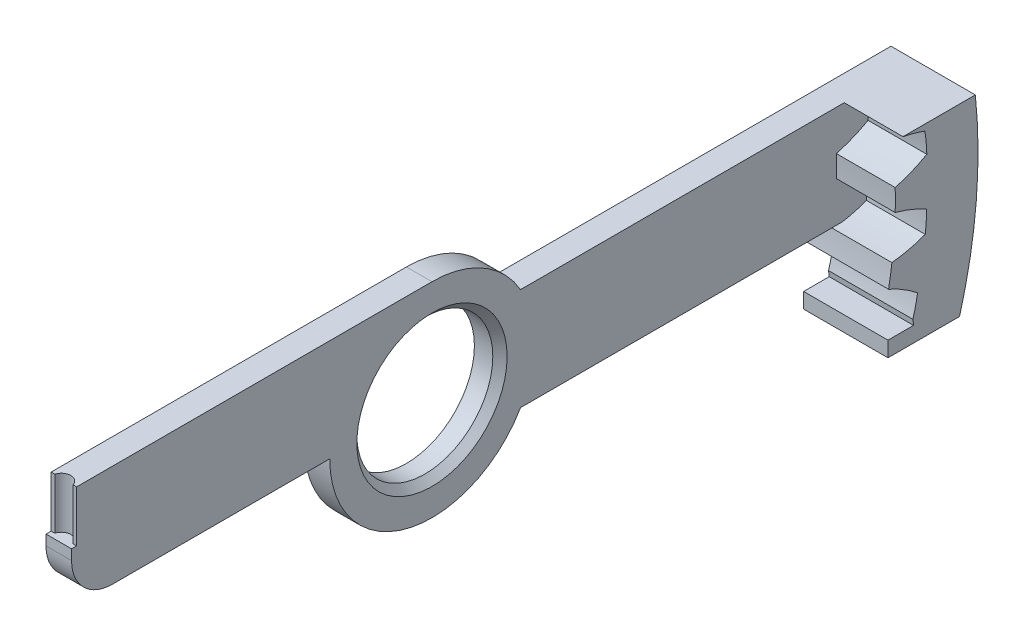
ISO-10303-21;
HEADER;
FILE_DESCRIPTION(('STEP AP214'),'2;1');
FILE_NAME('part.step','',(''),(''),'','','');
FILE_SCHEMA(('AUTOMOTIVE_DESIGN { 1 0 10303 214 1 1 1 1 }'));
ENDSEC;
DATA;
#1=APPLICATION_CONTEXT('core data for automotive mechanical design processes');
#2=APPLICATION_PROTOCOL_DEFINITION('international standard','automotive_design',2000,#1);
#3=PRODUCT_CONTEXT('',#1,'mechanical');
#4=PRODUCT('Part','Part','',(#3));
#5=PRODUCT_RELATED_PRODUCT_CATEGORY('part','',(#4));
#6=PRODUCT_DEFINITION_FORMATION('','',#4);
#7=PRODUCT_DEFINITION_CONTEXT('part definition',#1,'design');
#8=PRODUCT_DEFINITION('design','',#6,#7);
#9=PRODUCT_DEFINITION_SHAPE('','',#8);
#10=(LENGTH_UNIT() NAMED_UNIT(*) SI_UNIT(.MILLI.,.METRE.));
#11=(NAMED_UNIT(*) PLANE_ANGLE_UNIT() SI_UNIT($,.RADIAN.));
#12=(NAMED_UNIT(*) SI_UNIT($,.STERADIAN.) SOLID_ANGLE_UNIT());
#13=UNCERTAINTY_MEASURE_WITH_UNIT(LENGTH_MEASURE(1.E-05),#10,'distance_accuracy_value','');
#14=(GEOMETRIC_REPRESENTATION_CONTEXT(3) GLOBAL_UNCERTAINTY_ASSIGNED_CONTEXT((#13)) GLOBAL_UNIT_ASSIGNED_CONTEXT((#10,
#11,#12)) REPRESENTATION_CONTEXT('',''));
#15=CARTESIAN_POINT('',(0.,0.,0.));
#16=DIRECTION('',(0.,0.,1.));
#17=DIRECTION('',(1.,0.,0.));
#18=AXIS2_PLACEMENT_3D('',#15,#16,#17);
#19=CARTESIAN_POINT('',(1.25,0.,34.75));
#20=DIRECTION('',(0.,0.,-1.));
#21=DIRECTION('',(-1.,0.,0.));
#22=AXIS2_PLACEMENT_3D('',#19,#20,#21);
#23=PLANE('',#22);
#24=DIRECTION('',(-1.,0.,0.));
#25=VECTOR('',#24,1.);
#26=CARTESIAN_POINT('',(1.25,4.99999999999999,34.75));
#27=LINE('',#26,#25);
#28=CARTESIAN_POINT('',(-0.890575656527844,4.99999999999999,34.75));
#29=VERTEX_POINT('',#28);
#30=CARTESIAN_POINT('',(-1.25,4.99999999999999,34.75));
#31=VERTEX_POINT('',#30);
#32=EDGE_CURVE('E395',#29,#31,#27,.T.);
#33=ORIENTED_EDGE('',*,*,#32,.F.);
#34=DIRECTION('',(0.,1.,0.));
#35=VECTOR('',#34,1.);
#36=CARTESIAN_POINT('',(-0.890575656527844,4.99999999999999,34.75));
#37=LINE('',#36,#35);
#38=CARTESIAN_POINT('',(-0.890575656527844,9.99999999999999,34.75));
#39=VERTEX_POINT('',#38);
#40=EDGE_CURVE('E491',#29,#39,#37,.T.);
#41=ORIENTED_EDGE('',*,*,#40,.T.);
#42=DIRECTION('',(-1.,0.,0.));
#43=VECTOR('',#42,1.);
#44=CARTESIAN_POINT('',(1.25,9.99999999999999,34.75));
#45=LINE('',#44,#43);
#46=CARTESIAN_POINT('',(-1.25,9.99999999999999,34.75));
#47=VERTEX_POINT('',#46);
#48=EDGE_CURVE('E398',#39,#47,#45,.T.);
#49=ORIENTED_EDGE('',*,*,#48,.T.);
#50=DIRECTION('',(0.,-1.,0.));
#51=VECTOR('',#50,1.);
#52=CARTESIAN_POINT('',(-1.25,0.,34.75));
#53=LINE('',#52,#51);
#54=EDGE_CURVE('E386',#47,#31,#53,.T.);
#55=ORIENTED_EDGE('',*,*,#54,.T.);
#56=EDGE_LOOP('',(#33,#41,#49,#55));
#57=FACE_BOUND('',#56,.T.);
#58=ADVANCED_FACE('F37',(#57),#23,.F.);
#59=CARTESIAN_POINT('',(1.25,0.,35.25));
#60=DIRECTION('',(0.,0.,-1.));
#61=DIRECTION('',(-1.,0.,0.));
#62=AXIS2_PLACEMENT_3D('',#59,#60,#61);
#63=PLANE('',#62);
#64=DIRECTION('',(0.,-1.,0.));
#65=VECTOR('',#64,1.);
#66=CARTESIAN_POINT('',(-1.25,0.,35.25));
#67=LINE('',#66,#65);
#68=CARTESIAN_POINT('',(-1.25,4.99999999999999,35.25));
#69=VERTEX_POINT('',#68);
#70=CARTESIAN_POINT('',(-1.25,4.00000000000002,35.25));
#71=VERTEX_POINT('',#70);
#72=EDGE_CURVE('E288',#69,#71,#67,.T.);
#73=ORIENTED_EDGE('',*,*,#72,.T.);
#74=DIRECTION('',(-1.,0.,0.));
#75=VECTOR('',#74,1.);
#76=CARTESIAN_POINT('',(1.25,4.00000000000002,35.25));
#77=LINE('',#76,#75);
#78=CARTESIAN_POINT('',(1.25,4.00000000000002,35.25));
#79=VERTEX_POINT('',#78);
#80=EDGE_CURVE('E417',#79,#71,#77,.T.);
#81=ORIENTED_EDGE('',*,*,#80,.F.);
#82=DIRECTION('',(0.,-1.,0.));
#83=VECTOR('',#82,1.);
#84=CARTESIAN_POINT('',(1.25,0.,35.25));
#85=LINE('',#84,#83);
#86=CARTESIAN_POINT('',(1.25,4.99999999999999,35.25));
#87=VERTEX_POINT('',#86);
#88=EDGE_CURVE('E320',#87,#79,#85,.T.);
#89=ORIENTED_EDGE('',*,*,#88,.F.);
#90=DIRECTION('',(-1.,0.,0.));
#91=VECTOR('',#90,1.);
#92=CARTESIAN_POINT('',(1.25,4.99999999999999,35.25));
#93=LINE('',#92,#91);
#94=EDGE_CURVE('E367',#87,#69,#93,.T.);
#95=ORIENTED_EDGE('',*,*,#94,.T.);
#96=EDGE_LOOP('',(#73,#81,#89,#95));
#97=FACE_BOUND('',#96,.T.);
#98=ADVANCED_FACE('F454',(#97),#63,.F.);
#99=CARTESIAN_POINT('',(1.25,4.,31.25));
#100=DIRECTION('',(-1.,0.,0.));
#101=DIRECTION('',(0.,0.,1.));
#102=AXIS2_PLACEMENT_3D('',#99,#100,#101);
#103=CYLINDRICAL_SURFACE('',#102,4.);
#104=CARTESIAN_POINT('',(-1.25,4.,31.25));
#105=DIRECTION('',(1.,0.,0.));
#106=DIRECTION('',(0.,0.,-1.));
#107=AXIS2_PLACEMENT_3D('',#104,#105,#106);
#108=CIRCLE('',#107,4.);
#109=CARTESIAN_POINT('',(-1.25,0.,31.25));
#110=VERTEX_POINT('',#109);
#111=EDGE_CURVE('E370',#71,#110,#108,.T.);
#112=ORIENTED_EDGE('',*,*,#111,.T.);
#113=DIRECTION('',(-1.,0.,0.));
#114=VECTOR('',#113,1.);
#115=CARTESIAN_POINT('',(1.25,0.,31.25));
#116=LINE('',#115,#114);
#117=CARTESIAN_POINT('',(1.25,0.,31.25));
#118=VERTEX_POINT('',#117);
#119=EDGE_CURVE('E415',#118,#110,#116,.T.);
#120=ORIENTED_EDGE('',*,*,#119,.F.);
#121=CARTESIAN_POINT('',(1.25,4.,31.25));
#122=DIRECTION('',(1.,0.,0.));
#123=DIRECTION('',(0.,0.,-1.));
#124=AXIS2_PLACEMENT_3D('',#121,#122,#123);
#125=CIRCLE('',#124,4.);
#126=EDGE_CURVE('E323',#79,#118,#125,.T.);
#127=ORIENTED_EDGE('',*,*,#126,.F.);
#128=ORIENTED_EDGE('',*,*,#80,.T.);
#129=EDGE_LOOP('',(#112,#120,#127,#128));
#130=FACE_BOUND('',#129,.T.);
#131=ADVANCED_FACE('F461',(#130),#103,.T.);
#132=CARTESIAN_POINT('',(1.25,0.,0.));
#133=DIRECTION('',(0.,-1.,0.));
#134=DIRECTION('',(0.,0.,-1.));
#135=AXIS2_PLACEMENT_3D('',#132,#133,#134);
#136=PLANE('',#135);
#137=DIRECTION('',(0.,0.,1.));
#138=VECTOR('',#137,1.);
#139=CARTESIAN_POINT('',(-1.25,0.,0.));
#140=LINE('',#139,#138);
#141=CARTESIAN_POINT('',(-1.25,0.,10.));
#142=VERTEX_POINT('',#141);
#143=EDGE_CURVE('E373',#142,#110,#140,.T.);
#144=ORIENTED_EDGE('',*,*,#143,.F.);
#145=DIRECTION('',(-1.,0.,0.));
#146=VECTOR('',#145,1.);
#147=CARTESIAN_POINT('',(1.25,0.,10.));
#148=LINE('',#147,#146);
#149=CARTESIAN_POINT('',(1.25,0.,10.));
#150=VERTEX_POINT('',#149);
#151=EDGE_CURVE('E413',#150,#142,#148,.T.);
#152=ORIENTED_EDGE('',*,*,#151,.F.);
#153=DIRECTION('',(0.,0.,1.));
#154=VECTOR('',#153,1.);
#155=CARTESIAN_POINT('',(1.25,0.,0.));
#156=LINE('',#155,#154);
#157=EDGE_CURVE('E326',#150,#118,#156,.T.);
#158=ORIENTED_EDGE('',*,*,#157,.T.);
#159=ORIENTED_EDGE('',*,*,#119,.T.);
#160=EDGE_LOOP('',(#144,#152,#158,#159));
#161=FACE_BOUND('',#160,.T.);
#162=ADVANCED_FACE('F673',(#161),#136,.T.);
#163=CARTESIAN_POINT('',(1.25,0.,0.));
#164=DIRECTION('',(-1.,0.,0.));
#165=DIRECTION('',(0.,0.,1.));
#166=AXIS2_PLACEMENT_3D('',#163,#164,#165);
#167=CYLINDRICAL_SURFACE('',#166,10.);
#168=CARTESIAN_POINT('',(-1.25,0.,0.));
#169=DIRECTION('',(1.,0.,0.));
#170=DIRECTION('',(0.,0.,-1.));
#171=AXIS2_PLACEMENT_3D('',#168,#169,#170);
#172=CIRCLE('',#171,10.);
#173=CARTESIAN_POINT('',(-1.25,-5.00000000000216,-8.66025403784314));
#174=VERTEX_POINT('',#173);
#175=EDGE_CURVE('E376',#142,#174,#172,.T.);
#176=ORIENTED_EDGE('',*,*,#175,.T.);
#177=DIRECTION('',(-1.,0.,0.));
#178=VECTOR('',#177,1.);
#179=CARTESIAN_POINT('',(1.25,-5.00000000000216,-8.66025403784314));
#180=LINE('',#179,#178);
#181=CARTESIAN_POINT('',(1.25,-5.00000000000216,-8.66025403784314));
#182=VERTEX_POINT('',#181);
#183=EDGE_CURVE('E410',#182,#174,#180,.T.);
#184=ORIENTED_EDGE('',*,*,#183,.F.);
#185=CARTESIAN_POINT('',(1.25,0.,0.));
#186=DIRECTION('',(1.,0.,0.));
#187=DIRECTION('',(0.,0.,-1.));
#188=AXIS2_PLACEMENT_3D('',#185,#186,#187);
#189=CIRCLE('',#188,10.);
#190=EDGE_CURVE('E329',#150,#182,#189,.T.);
#191=ORIENTED_EDGE('',*,*,#190,.F.);
#192=ORIENTED_EDGE('',*,*,#151,.T.);
#193=EDGE_LOOP('',(#176,#184,#191,#192));
#194=FACE_BOUND('',#193,.T.);
#195=ADVANCED_FACE('F678',(#194),#167,.T.);
#196=CARTESIAN_POINT('',(1.25,-5.00000000000216,0.));
#197=DIRECTION('',(0.,1.,0.));
#198=DIRECTION('',(0.,0.,1.));
#199=AXIS2_PLACEMENT_3D('',#196,#197,#198);
#200=PLANE('',#199);
#201=DIRECTION('',(0.,0.,-1.));
#202=VECTOR('',#201,1.);
#203=CARTESIAN_POINT('',(-1.25,-5.00000000000216,0.));
#204=LINE('',#203,#202);
#205=CARTESIAN_POINT('',(-1.25,-5.00000000000216,-40.1461106926721));
#206=VERTEX_POINT('',#205);
#207=EDGE_CURVE('E378',#174,#206,#204,.T.);
#208=ORIENTED_EDGE('',*,*,#207,.T.);
#209=DIRECTION('',(-1.,0.,0.));
#210=VECTOR('',#209,1.);
#211=CARTESIAN_POINT('',(1.25,-5.00000000000216,-40.1461106926721));
#212=LINE('',#211,#210);
#213=CARTESIAN_POINT('',(1.25,-5.00000000000216,-40.1461106926721));
#214=VERTEX_POINT('',#213);
#215=EDGE_CURVE('E407',#214,#206,#212,.T.);
#216=ORIENTED_EDGE('',*,*,#215,.F.);
#217=DIRECTION('',(0.,0.,-1.));
#218=VECTOR('',#217,1.);
#219=CARTESIAN_POINT('',(1.25,-5.00000000000216,0.));
#220=LINE('',#219,#218);
#221=EDGE_CURVE('E331',#182,#214,#220,.T.);
#222=ORIENTED_EDGE('',*,*,#221,.F.);
#223=ORIENTED_EDGE('',*,*,#183,.T.);
#224=EDGE_LOOP('',(#208,#216,#222,#223));
#225=FACE_BOUND('',#224,.T.);
#226=ADVANCED_FACE('F682',(#225),#200,.F.);
#227=CARTESIAN_POINT('',(1.25,5.00000000001012,-4.59267688199947E-12));
#228=DIRECTION('',(0.,1.,-9.18535376398035E-13));
#229=DIRECTION('',(0.,9.18535376398035E-13,1.));
#230=AXIS2_PLACEMENT_3D('',#227,#228,#229);
#231=PLANE('',#230);
#232=DIRECTION('',(0.,-9.18535376398035E-13,-1.));
#233=VECTOR('',#232,1.);
#234=CARTESIAN_POINT('',(1.25,5.00000000001012,-4.59267688199947E-12));
#235=LINE('',#234,#233);
#236=CARTESIAN_POINT('',(1.25,5.00000000000216,-8.66025403784314));
#237=VERTEX_POINT('',#236);
#238=CARTESIAN_POINT('',(1.25,5.00000000000216,-40.3212792526943));
#239=VERTEX_POINT('',#238);
#240=EDGE_CURVE('E358',#237,#239,#235,.T.);
#241=ORIENTED_EDGE('',*,*,#240,.T.);
#242=DIRECTION('',(1.,0.,0.));
#243=VECTOR('',#242,1.);
#244=CARTESIAN_POINT('',(-1.25,5.00000000000216,-40.3212792526943));
#245=LINE('',#244,#243);
#246=CARTESIAN_POINT('',(7.,5.00000000000216,-40.3212792526943));
#247=VERTEX_POINT('',#246);
#248=EDGE_CURVE('E51',#247,#239,#245,.F.);
#249=ORIENTED_EDGE('',*,*,#248,.F.);
#250=DIRECTION('',(0.,0.,-1.));
#251=VECTOR('',#250,1.);
#252=CARTESIAN_POINT('',(7.,5.00000000000216,0.));
#253=LINE('',#252,#251);
#254=CARTESIAN_POINT('',(7.,5.00000000000216,-47.3937881405345));
#255=VERTEX_POINT('',#254);
#256=EDGE_CURVE('E11',#247,#255,#253,.T.);
#257=ORIENTED_EDGE('',*,*,#256,.T.);
#258=DIRECTION('',(1.,0.,0.));
#259=VECTOR('',#258,1.);
#260=CARTESIAN_POINT('',(-1.25,5.00000000000216,-47.3937881405345));
#261=LINE('',#260,#259);
#262=CARTESIAN_POINT('',(-1.25,5.00000000000216,-47.3937881405345));
#263=VERTEX_POINT('',#262);
#264=EDGE_CURVE('E240',#255,#263,#261,.F.);
#265=ORIENTED_EDGE('',*,*,#264,.T.);
#266=DIRECTION('',(0.,-9.18535376398035E-13,-1.));
#267=VECTOR('',#266,1.);
#268=CARTESIAN_POINT('',(-1.25,5.00000000001012,-4.59267688199947E-12));
#269=LINE('',#268,#267);
#270=CARTESIAN_POINT('',(-1.25,5.00000000000216,-8.66025403784314));
#271=VERTEX_POINT('',#270);
#272=EDGE_CURVE('E381',#271,#263,#269,.T.);
#273=ORIENTED_EDGE('',*,*,#272,.F.);
#274=DIRECTION('',(-1.,0.,0.));
#275=VECTOR('',#274,1.);
#276=CARTESIAN_POINT('',(1.25,5.00000000000216,-8.66025403784314));
#277=LINE('',#276,#275);
#278=EDGE_CURVE('E405',#237,#271,#277,.T.);
#279=ORIENTED_EDGE('',*,*,#278,.F.);
#280=EDGE_LOOP('',(#241,#249,#257,#265,#273,#279));
#281=FACE_BOUND('',#280,.T.);
#282=ADVANCED_FACE('F238',(#281),#231,.T.);
#283=CARTESIAN_POINT('',(-1.25,9.99999999999999,0.));
#284=VERTEX_POINT('',#283);
#285=EDGE_CURVE('E379',#271,#284,#172,.T.);
#286=ORIENTED_EDGE('',*,*,#285,.T.);
#287=DIRECTION('',(-1.,0.,0.));
#288=VECTOR('',#287,1.);
#289=CARTESIAN_POINT('',(1.25,9.99999999999999,0.));
#290=LINE('',#289,#288);
#291=CARTESIAN_POINT('',(1.25,9.99999999999999,0.));
#292=VERTEX_POINT('',#291);
#293=EDGE_CURVE('E402',#292,#284,#290,.T.);
#294=ORIENTED_EDGE('',*,*,#293,.F.);
#295=EDGE_CURVE('E332',#237,#292,#189,.T.);
#296=ORIENTED_EDGE('',*,*,#295,.F.);
#297=ORIENTED_EDGE('',*,*,#278,.T.);
#298=EDGE_LOOP('',(#286,#294,#296,#297));
#299=FACE_BOUND('',#298,.T.);
#300=ADVANCED_FACE('F473',(#299),#167,.T.);
#301=CARTESIAN_POINT('',(1.25,9.99999999999999,0.));
#302=DIRECTION('',(0.,-1.,0.));
#303=DIRECTION('',(0.,0.,-1.));
#304=AXIS2_PLACEMENT_3D('',#301,#302,#303);
#305=PLANE('',#304);
#306=ORIENTED_EDGE('',*,*,#48,.F.);
#307=CARTESIAN_POINT('',(0.,9.99999999999999,35.));
#308=DIRECTION('',(0.,1.,0.));
#309=DIRECTION('',(0.,0.,1.));
#310=AXIS2_PLACEMENT_3D('',#307,#308,#309);
#311=CIRCLE('',#310,0.925000000000001);
#312=CARTESIAN_POINT('',(0.890575656527844,9.99999999999999,34.75));
#313=VERTEX_POINT('',#312);
#314=EDGE_CURVE('E483',#313,#39,#311,.T.);
#315=ORIENTED_EDGE('',*,*,#314,.F.);
#316=CARTESIAN_POINT('',(1.25,9.99999999999999,34.75));
#317=VERTEX_POINT('',#316);
#318=EDGE_CURVE('E399',#317,#313,#45,.T.);
#319=ORIENTED_EDGE('',*,*,#318,.F.);
#320=DIRECTION('',(0.,0.,1.));
#321=VECTOR('',#320,1.);
#322=CARTESIAN_POINT('',(1.25,9.99999999999999,0.));
#323=LINE('',#322,#321);
#324=EDGE_CURVE('E360',#292,#317,#323,.T.);
#325=ORIENTED_EDGE('',*,*,#324,.F.);
#326=ORIENTED_EDGE('',*,*,#293,.T.);
#327=DIRECTION('',(0.,0.,1.));
#328=VECTOR('',#327,1.);
#329=CARTESIAN_POINT('',(-1.25,9.99999999999999,0.));
#330=LINE('',#329,#328);
#331=EDGE_CURVE('E383',#284,#47,#330,.T.);
#332=ORIENTED_EDGE('',*,*,#331,.T.);
#333=EDGE_LOOP('',(#306,#315,#319,#325,#326,#332));
#334=FACE_BOUND('',#333,.T.);
#335=ADVANCED_FACE('F467',(#334),#305,.F.);
#336=ORIENTED_EDGE('',*,*,#318,.T.);
#337=DIRECTION('',(0.,1.,0.));
#338=VECTOR('',#337,1.);
#339=CARTESIAN_POINT('',(0.890575656527844,4.99999999999999,34.75));
#340=LINE('',#339,#338);
#341=CARTESIAN_POINT('',(0.890575656527844,4.99999999999999,34.75));
#342=VERTEX_POINT('',#341);
#343=EDGE_CURVE('E479',#313,#342,#340,.F.);
#344=ORIENTED_EDGE('',*,*,#343,.T.);
#345=CARTESIAN_POINT('',(1.25,4.99999999999999,34.75));
#346=VERTEX_POINT('',#345);
#347=EDGE_CURVE('E396',#346,#342,#27,.T.);
#348=ORIENTED_EDGE('',*,*,#347,.F.);
#349=DIRECTION('',(0.,-1.,0.));
#350=VECTOR('',#349,1.);
#351=CARTESIAN_POINT('',(1.25,0.,34.75));
#352=LINE('',#351,#350);
#353=EDGE_CURVE('E362',#317,#346,#352,.T.);
#354=ORIENTED_EDGE('',*,*,#353,.F.);
#355=EDGE_LOOP('',(#336,#344,#348,#354));
#356=FACE_BOUND('',#355,.T.);
#357=ADVANCED_FACE('F457',(#356),#23,.F.);
#358=CARTESIAN_POINT('',(1.25,4.99999999999999,0.));
#359=DIRECTION('',(0.,1.,0.));
#360=DIRECTION('',(0.,0.,1.));
#361=AXIS2_PLACEMENT_3D('',#358,#359,#360);
#362=PLANE('',#361);
#363=DIRECTION('',(0.,0.,-1.));
#364=VECTOR('',#363,1.);
#365=CARTESIAN_POINT('',(-1.25,4.99999999999999,0.));
#366=LINE('',#365,#364);
#367=EDGE_CURVE('E389',#69,#31,#366,.T.);
#368=ORIENTED_EDGE('',*,*,#367,.F.);
#369=ORIENTED_EDGE('',*,*,#94,.F.);
#370=DIRECTION('',(0.,0.,-1.));
#371=VECTOR('',#370,1.);
#372=CARTESIAN_POINT('',(1.25,4.99999999999999,0.));
#373=LINE('',#372,#371);
#374=EDGE_CURVE('E364',#87,#346,#373,.T.);
#375=ORIENTED_EDGE('',*,*,#374,.T.);
#376=ORIENTED_EDGE('',*,*,#347,.T.);
#377=CARTESIAN_POINT('',(0.,4.99999999999999,35.));
#378=DIRECTION('',(0.,1.,0.));
#379=DIRECTION('',(0.,0.,1.));
#380=AXIS2_PLACEMENT_3D('',#377,#378,#379);
#381=CIRCLE('',#380,0.925000000000001);
#382=EDGE_CURVE('E59',#342,#29,#381,.T.);
#383=ORIENTED_EDGE('',*,*,#382,.T.);
#384=ORIENTED_EDGE('',*,*,#32,.T.);
#385=EDGE_LOOP('',(#368,#369,#375,#376,#383,#384));
#386=FACE_BOUND('',#385,.T.);
#387=ADVANCED_FACE('F436',(#386),#362,.T.);
#388=CARTESIAN_POINT('',(1.25,0.,0.));
#389=DIRECTION('',(-1.,0.,0.));
#390=DIRECTION('',(0.,0.,1.));
#391=AXIS2_PLACEMENT_3D('',#388,#389,#390);
#392=CYLINDRICAL_SURFACE('',#391,6.65);
#393=CARTESIAN_POINT('',(0.550000000000002,0.,0.));
#394=DIRECTION('',(1.,0.,0.));
#395=DIRECTION('',(0.,0.,-1.));
#396=AXIS2_PLACEMENT_3D('',#393,#394,#395);
#397=CIRCLE('',#396,6.65);
#398=CARTESIAN_POINT('',(0.550000000000002,0.,-6.65));
#399=VERTEX_POINT('',#398);
#400=EDGE_CURVE('E420',#399,#399,#397,.T.);
#401=ORIENTED_EDGE('',*,*,#400,.T.);
#402=EDGE_LOOP('',(#401));
#403=FACE_BOUND('',#402,.T.);
#404=CARTESIAN_POINT('',(-1.25,0.,0.));
#405=DIRECTION('',(1.,0.,0.));
#406=DIRECTION('',(0.,0.,-1.));
#407=AXIS2_PLACEMENT_3D('',#404,#405,#406);
#408=CIRCLE('',#407,6.65);
#409=CARTESIAN_POINT('',(-1.25,0.,-6.65));
#410=VERTEX_POINT('',#409);
#411=EDGE_CURVE('E324',#410,#410,#408,.T.);
#412=ORIENTED_EDGE('',*,*,#411,.F.);
#413=EDGE_LOOP('',(#412));
#414=FACE_BOUND('',#413,.T.);
#415=ADVANCED_FACE('F433',(#403,#414),#392,.F.);
#416=CARTESIAN_POINT('',(1.25,0.,0.));
#417=DIRECTION('',(1.,0.,0.));
#418=DIRECTION('',(0.,0.,-1.));
#419=AXIS2_PLACEMENT_3D('',#416,#417,#418);
#420=PLANE('',#419);
#421=CARTESIAN_POINT('',(1.25,0.,0.));
#422=DIRECTION('',(1.,0.,0.));
#423=DIRECTION('',(0.,0.,-1.));
#424=AXIS2_PLACEMENT_3D('',#421,#422,#423);
#425=CIRCLE('',#424,7.35);
#426=CARTESIAN_POINT('',(1.25,0.,-7.35));
#427=VERTEX_POINT('',#426);
#428=EDGE_CURVE('E45',#427,#427,#425,.F.);
#429=ORIENTED_EDGE('',*,*,#428,.T.);
#430=EDGE_LOOP('',(#429));
#431=FACE_BOUND('',#430,.T.);
#432=ORIENTED_EDGE('',*,*,#88,.T.);
#433=ORIENTED_EDGE('',*,*,#126,.T.);
#434=ORIENTED_EDGE('',*,*,#157,.F.);
#435=ORIENTED_EDGE('',*,*,#190,.T.);
#436=ORIENTED_EDGE('',*,*,#221,.T.);
#437=CARTESIAN_POINT('',(1.25,7.68681385261856,-37.9386856943336));
#438=DIRECTION('',(1.,0.,0.));
#439=DIRECTION('',(0.,0.,-1.));
#440=AXIS2_PLACEMENT_3D('',#437,#438,#439);
#441=CIRCLE('',#440,12.8774209706113);
#442=CARTESIAN_POINT('',(1.25,-4.35883727464742,-42.4917351970883));
#443=VERTEX_POINT('',#442);
#444=EDGE_CURVE('E334',#443,#214,#441,.F.);
#445=ORIENTED_EDGE('',*,*,#444,.F.);
#446=CARTESIAN_POINT('',(1.25,-2.24811715613599,-26.1294710166601));
#447=DIRECTION('',(1.,0.,0.));
#448=DIRECTION('',(0.,0.,-1.));
#449=AXIS2_PLACEMENT_3D('',#446,#447,#448);
#450=CIRCLE('',#449,16.4978431477818);
#451=CARTESIAN_POINT('',(1.25,-2.30645943365365,-42.6272110045331));
#452=VERTEX_POINT('',#451);
#453=EDGE_CURVE('E337',#452,#443,#450,.F.);
#454=ORIENTED_EDGE('',*,*,#453,.F.);
#455=DIRECTION('',(0.,1.,5.30085583652952E-13));
#456=VECTOR('',#455,1.);
#457=CARTESIAN_POINT('',(1.25,2.25960700248348E-11,-42.6272110045319));
#458=LINE('',#457,#456);
#459=CARTESIAN_POINT('',(1.25,-2.29336929478195,-42.6272110045331));
#460=VERTEX_POINT('',#459);
#461=EDGE_CURVE('E340',#452,#460,#458,.T.);
#462=ORIENTED_EDGE('',*,*,#461,.T.);
#463=CARTESIAN_POINT('',(1.25,-13.4978722893725,-36.2800003180544));
#464=DIRECTION('',(1.,0.,0.));
#465=DIRECTION('',(0.,0.,-1.));
#466=AXIS2_PLACEMENT_3D('',#463,#464,#465);
#467=CIRCLE('',#466,12.8774209706113);
#468=CARTESIAN_POINT('',(1.25,-1.04383287209595,-39.5548855140972));
#469=VERTEX_POINT('',#468);
#470=EDGE_CURVE('E342',#460,#469,#467,.T.);
#471=ORIENTED_EDGE('',*,*,#470,.T.);
#472=CARTESIAN_POINT('',(1.25,0.0012565384882364,-3.11957942145827));
#473=DIRECTION('',(1.,0.,0.));
#474=DIRECTION('',(0.,0.,-1.));
#475=AXIS2_PLACEMENT_3D('',#472,#473,#474);
#476=CIRCLE('',#475,36.4502913834777);
#477=CARTESIAN_POINT('',(1.25,1.07569723139026,-39.5540317864634));
#478=VERTEX_POINT('',#477);
#479=EDGE_CURVE('E344',#478,#469,#476,.F.);
#480=ORIENTED_EDGE('',*,*,#479,.F.);
#481=CARTESIAN_POINT('',(1.25,13.5270944194791,-36.2691149048986));
#482=DIRECTION('',(1.,0.,0.));
#483=DIRECTION('',(0.,0.,-1.));
#484=AXIS2_PLACEMENT_3D('',#481,#482,#483);
#485=CIRCLE('',#484,12.8774209706112);
#486=CARTESIAN_POINT('',(1.25,2.34199910946688,-42.6504638030767));
#487=VERTEX_POINT('',#486);
#488=EDGE_CURVE('E347',#487,#478,#485,.F.);
#489=ORIENTED_EDGE('',*,*,#488,.F.);
#490=CARTESIAN_POINT('',(1.25,1.86711071686803,-26.1594568737416));
#491=DIRECTION('',(1.,0.,0.));
#492=DIRECTION('',(0.,0.,-1.));
#493=AXIS2_PLACEMENT_3D('',#490,#491,#492);
#494=CIRCLE('',#493,16.4978431477815);
#495=CARTESIAN_POINT('',(1.25,4.3903018589758,-42.4632090489064));
#496=VERTEX_POINT('',#495);
#497=EDGE_CURVE('E350',#496,#487,#494,.F.);
#498=ORIENTED_EDGE('',*,*,#497,.F.);
#499=DIRECTION('',(0.,1.,5.70543863276689E-13));
#500=VECTOR('',#499,1.);
#501=CARTESIAN_POINT('',(1.25,2.42271233378902E-11,-42.4632090489089));
#502=LINE('',#501,#500);
#503=CARTESIAN_POINT('',(1.25,4.40246375282925,-42.4632090489064));
#504=VERTEX_POINT('',#503);
#505=EDGE_CURVE('E353',#496,#504,#502,.T.);
#506=ORIENTED_EDGE('',*,*,#505,.T.);
#507=CARTESIAN_POINT('',(1.25,-7.6562486416412,-37.9448657416992));
#508=DIRECTION('',(1.,0.,0.));
#509=DIRECTION('',(0.,0.,-1.));
#510=AXIS2_PLACEMENT_3D('',#507,#508,#509);
#511=CIRCLE('',#510,12.8774209706113);
#512=EDGE_CURVE('E355',#504,#239,#511,.T.);
#513=ORIENTED_EDGE('',*,*,#512,.T.);
#514=ORIENTED_EDGE('',*,*,#240,.F.);
#515=ORIENTED_EDGE('',*,*,#295,.T.);
#516=ORIENTED_EDGE('',*,*,#324,.T.);
#517=ORIENTED_EDGE('',*,*,#353,.T.);
#518=ORIENTED_EDGE('',*,*,#374,.F.);
#519=EDGE_LOOP('',(#432,#433,#434,#435,#436,#445,#454,#462,#471,#480,#489,#498,#506,#513,#514,
#515,#516,#517,#518));
#520=FACE_BOUND('',#519,.T.);
#521=ADVANCED_FACE('F425',(#431,#520),#420,.T.);
#522=CARTESIAN_POINT('',(-1.25,0.,0.));
#523=DIRECTION('',(1.,0.,0.));
#524=DIRECTION('',(0.,0.,-1.));
#525=AXIS2_PLACEMENT_3D('',#522,#523,#524);
#526=PLANE('',#525);
#527=ORIENTED_EDGE('',*,*,#272,.T.);
#528=CARTESIAN_POINT('',(-1.25,0.,0.));
#529=DIRECTION('',(1.,0.,0.));
#530=DIRECTION('',(0.,0.,-1.));
#531=AXIS2_PLACEMENT_3D('',#528,#529,#530);
#532=CIRCLE('',#531,47.6568059600084);
#533=CARTESIAN_POINT('',(-1.25,-13.,-45.8494400653911));
#534=VERTEX_POINT('',#533);
#535=EDGE_CURVE('E252',#534,#263,#532,.T.);
#536=ORIENTED_EDGE('',*,*,#535,.F.);
#537=DIRECTION('',(0.,0.,1.));
#538=VECTOR('',#537,1.);
#539=CARTESIAN_POINT('',(-1.25,-13.,0.));
#540=LINE('',#539,#538);
#541=CARTESIAN_POINT('',(-1.25,-13.,-38.8494400653911));
#542=VERTEX_POINT('',#541);
#543=EDGE_CURVE('E282',#534,#542,#540,.T.);
#544=ORIENTED_EDGE('',*,*,#543,.T.);
#545=DIRECTION('',(0.,1.,0.));
#546=VECTOR('',#545,1.);
#547=CARTESIAN_POINT('',(-1.25,0.,-38.8494400653911));
#548=LINE('',#547,#546);
#549=CARTESIAN_POINT('',(-1.25,-11.5,-38.8494400653911));
#550=VERTEX_POINT('',#549);
#551=EDGE_CURVE('E280',#542,#550,#548,.T.);
#552=ORIENTED_EDGE('',*,*,#551,.T.);
#553=DIRECTION('',(0.,0.,-1.));
#554=VECTOR('',#553,1.);
#555=CARTESIAN_POINT('',(-1.25,-11.5,0.));
#556=LINE('',#555,#554);
#557=CARTESIAN_POINT('',(-1.25,-11.5,-41.3494400653911));
#558=VERTEX_POINT('',#557);
#559=EDGE_CURVE('E278',#550,#558,#556,.T.);
#560=ORIENTED_EDGE('',*,*,#559,.T.);
#561=DIRECTION('',(0.,-0.993505665049841,-0.113782659108814));
#562=VECTOR('',#561,1.);
#563=CARTESIAN_POINT('',(-1.25,4.52540970101519,-39.5141070690783));
#564=LINE('',#563,#562);
#565=CARTESIAN_POINT('',(-1.25,-10.9523446189084,-41.2867190485635));
#566=VERTEX_POINT('',#565);
#567=EDGE_CURVE('E275',#566,#558,#564,.T.);
#568=ORIENTED_EDGE('',*,*,#567,.F.);
#569=CARTESIAN_POINT('',(-1.25,-6.30798892368286,-25.4560908644058));
#570=DIRECTION('',(1.,0.,0.));
#571=DIRECTION('',(0.,0.,-1.));
#572=AXIS2_PLACEMENT_3D('',#569,#570,#571);
#573=CIRCLE('',#572,16.4978431477822);
#574=CARTESIAN_POINT('',(-1.25,-8.94642804032661,-41.7415895536259));
#575=VERTEX_POINT('',#574);
#576=EDGE_CURVE('E272',#575,#566,#573,.F.);
#577=ORIENTED_EDGE('',*,*,#576,.F.);
#578=DIRECTION('',(0.,1.,4.76595269595817E-13));
#579=VECTOR('',#578,1.);
#580=CARTESIAN_POINT('',(-1.25,1.98938441266662E-11,-41.7415895536216));
#581=LINE('',#580,#579);
#582=CARTESIAN_POINT('',(-1.25,-8.93186873949723,-41.7415895536259));
#583=VERTEX_POINT('',#582);
#584=EDGE_CURVE('E270',#575,#583,#581,.T.);
#585=ORIENTED_EDGE('',*,*,#584,.T.);
#586=CARTESIAN_POINT('',(-1.25,-19.0071335244697,-33.7218008801612));
#587=DIRECTION('',(1.,0.,0.));
#588=DIRECTION('',(0.,0.,-1.));
#589=AXIS2_PLACEMENT_3D('',#586,#587,#588);
#590=CIRCLE('',#589,12.8774209706113);
#591=CARTESIAN_POINT('',(-1.25,-7.21872891242453,-38.9046077989119));
#592=VERTEX_POINT('',#591);
#593=EDGE_CURVE('E268',#583,#592,#590,.T.);
#594=ORIENTED_EDGE('',*,*,#593,.T.);
#595=CARTESIAN_POINT('',(-1.25,-0.486768669535452,-3.08136878806042));
#596=DIRECTION('',(1.,0.,0.));
#597=DIRECTION('',(0.,0.,-1.));
#598=AXIS2_PLACEMENT_3D('',#595,#596,#597);
#599=CIRCLE('',#598,36.4502913834777);
#600=CARTESIAN_POINT('',(-1.25,-5.12516018924516,-39.2353321399575));
#601=VERTEX_POINT('',#600);
#602=EDGE_CURVE('E260',#601,#592,#599,.F.);
#603=ORIENTED_EDGE('',*,*,#602,.F.);
#604=CARTESIAN_POINT('',(-1.25,7.68681385261856,-37.9386856943336));
#605=DIRECTION('',(1.,0.,0.));
#606=DIRECTION('',(0.,0.,-1.));
#607=AXIS2_PLACEMENT_3D('',#604,#605,#606);
#608=CIRCLE('',#607,12.8774209706113);
#609=EDGE_CURVE('E258',#206,#601,#608,.F.);
#610=ORIENTED_EDGE('',*,*,#609,.F.);
#611=ORIENTED_EDGE('',*,*,#207,.F.);
#612=ORIENTED_EDGE('',*,*,#175,.F.);
#613=ORIENTED_EDGE('',*,*,#143,.T.);
#614=ORIENTED_EDGE('',*,*,#111,.F.);
#615=ORIENTED_EDGE('',*,*,#72,.F.);
#616=ORIENTED_EDGE('',*,*,#367,.T.);
#617=ORIENTED_EDGE('',*,*,#54,.F.);
#618=ORIENTED_EDGE('',*,*,#331,.F.);
#619=ORIENTED_EDGE('',*,*,#285,.F.);
#620=EDGE_LOOP('',(#527,#536,#544,#552,#560,#568,#577,#585,#594,#603,#610,#611,#612,#613,#614,
#615,#616,#617,#618,#619));
#621=FACE_BOUND('',#620,.T.);
#622=ORIENTED_EDGE('',*,*,#411,.T.);
#623=EDGE_LOOP('',(#622));
#624=FACE_BOUND('',#623,.T.);
#625=ADVANCED_FACE('F440',(#621,#624),#526,.F.);
#626=CARTESIAN_POINT('',(-1.25,7.68681385261856,-37.9386856943336));
#627=DIRECTION('',(1.,0.,0.));
#628=DIRECTION('',(0.,0.,-1.));
#629=AXIS2_PLACEMENT_3D('',#626,#627,#628);
#630=CYLINDRICAL_SURFACE('',#629,12.8774209706113);
#631=ORIENTED_EDGE('',*,*,#215,.T.);
#632=ORIENTED_EDGE('',*,*,#609,.T.);
#633=DIRECTION('',(1.,0.,0.));
#634=VECTOR('',#633,1.);
#635=CARTESIAN_POINT('',(-1.25,-5.12516018924516,-39.2353321399575));
#636=LINE('',#635,#634);
#637=CARTESIAN_POINT('',(7.,-5.12516018924516,-39.2353321399575));
#638=VERTEX_POINT('',#637);
#639=EDGE_CURVE('E303',#601,#638,#636,.T.);
#640=ORIENTED_EDGE('',*,*,#639,.T.);
#641=CARTESIAN_POINT('',(7.,7.68681385261856,-37.9386856943336));
#642=DIRECTION('',(1.,0.,0.));
#643=DIRECTION('',(0.,0.,-1.));
#644=AXIS2_PLACEMENT_3D('',#641,#642,#643);
#645=CIRCLE('',#644,12.8774209706113);
#646=CARTESIAN_POINT('',(7.,-4.35883727464742,-42.4917351970883));
#647=VERTEX_POINT('',#646);
#648=EDGE_CURVE('E516',#647,#638,#645,.F.);
#649=ORIENTED_EDGE('',*,*,#648,.F.);
#650=DIRECTION('',(1.,0.,0.));
#651=VECTOR('',#650,1.);
#652=CARTESIAN_POINT('',(-1.25,-4.35883727464742,-42.4917351970883));
#653=LINE('',#652,#651);
#654=EDGE_CURVE('E305',#443,#647,#653,.T.);
#655=ORIENTED_EDGE('',*,*,#654,.F.);
#656=ORIENTED_EDGE('',*,*,#444,.T.);
#657=EDGE_LOOP('',(#631,#632,#640,#649,#655,#656));
#658=FACE_BOUND('',#657,.T.);
#659=ADVANCED_FACE('F442',(#658),#630,.F.);
#660=CARTESIAN_POINT('',(-1.25,-7.6562486416412,-37.9448657416992));
#661=DIRECTION('',(1.,0.,0.));
#662=DIRECTION('',(0.,0.,-1.));
#663=AXIS2_PLACEMENT_3D('',#660,#661,#662);
#664=CYLINDRICAL_SURFACE('',#663,12.8774209706113);
#665=CARTESIAN_POINT('',(7.,-7.6562486416412,-37.9448657416992));
#666=DIRECTION('',(1.,0.,0.));
#667=DIRECTION('',(0.,0.,-1.));
#668=AXIS2_PLACEMENT_3D('',#665,#666,#667);
#669=CIRCLE('',#668,12.8774209706113);
#670=CARTESIAN_POINT('',(7.,4.40246375282925,-42.4632090489064));
#671=VERTEX_POINT('',#670);
#672=EDGE_CURVE('E493',#671,#247,#669,.T.);
#673=ORIENTED_EDGE('',*,*,#672,.T.);
#674=ORIENTED_EDGE('',*,*,#248,.T.);
#675=ORIENTED_EDGE('',*,*,#512,.F.);
#676=DIRECTION('',(1.,0.,0.));
#677=VECTOR('',#676,1.);
#678=CARTESIAN_POINT('',(-1.25,4.40246375282925,-42.4632090489064));
#679=LINE('',#678,#677);
#680=EDGE_CURVE('E285',#504,#671,#679,.T.);
#681=ORIENTED_EDGE('',*,*,#680,.T.);
#682=EDGE_LOOP('',(#673,#674,#675,#681));
#683=FACE_BOUND('',#682,.T.);
#684=ADVANCED_FACE('F449',(#683),#664,.F.);
#685=CARTESIAN_POINT('',(-1.25,0.,0.));
#686=DIRECTION('',(1.,0.,0.));
#687=DIRECTION('',(0.,0.,-1.));
#688=AXIS2_PLACEMENT_3D('',#685,#686,#687);
#689=CYLINDRICAL_SURFACE('',#688,47.6568059600084);
#690=ORIENTED_EDGE('',*,*,#264,.F.);
#691=CARTESIAN_POINT('',(7.,0.,0.));
#692=DIRECTION('',(1.,0.,0.));
#693=DIRECTION('',(0.,0.,-1.));
#694=AXIS2_PLACEMENT_3D('',#691,#692,#693);
#695=CIRCLE('',#694,47.6568059600084);
#696=CARTESIAN_POINT('',(7.,-13.,-45.8494400653911));
#697=VERTEX_POINT('',#696);
#698=EDGE_CURVE('E249',#697,#255,#695,.T.);
#699=ORIENTED_EDGE('',*,*,#698,.F.);
#700=DIRECTION('',(1.,0.,0.));
#701=VECTOR('',#700,1.);
#702=CARTESIAN_POINT('',(-1.25,-13.,-45.8494400653911));
#703=LINE('',#702,#701);
#704=EDGE_CURVE('E286',#534,#697,#703,.T.);
#705=ORIENTED_EDGE('',*,*,#704,.F.);
#706=ORIENTED_EDGE('',*,*,#535,.T.);
#707=EDGE_LOOP('',(#690,#699,#705,#706));
#708=FACE_BOUND('',#707,.T.);
#709=ADVANCED_FACE('F248',(#708),#689,.T.);
#710=CARTESIAN_POINT('',(-1.25,-13.,0.));
#711=DIRECTION('',(0.,1.,0.));
#712=DIRECTION('',(0.,0.,1.));
#713=AXIS2_PLACEMENT_3D('',#710,#711,#712);
#714=PLANE('',#713);
#715=ORIENTED_EDGE('',*,*,#704,.T.);
#716=DIRECTION('',(0.,0.,1.));
#717=VECTOR('',#716,1.);
#718=CARTESIAN_POINT('',(7.,-13.,0.));
#719=LINE('',#718,#717);
#720=CARTESIAN_POINT('',(7.,-13.,-38.8494400653911));
#721=VERTEX_POINT('',#720);
#722=EDGE_CURVE('E257',#697,#721,#719,.T.);
#723=ORIENTED_EDGE('',*,*,#722,.T.);
#724=DIRECTION('',(1.,0.,0.));
#725=VECTOR('',#724,1.);
#726=CARTESIAN_POINT('',(-1.25,-13.,-38.8494400653911));
#727=LINE('',#726,#725);
#728=EDGE_CURVE('E289',#542,#721,#727,.T.);
#729=ORIENTED_EDGE('',*,*,#728,.F.);
#730=ORIENTED_EDGE('',*,*,#543,.F.);
#731=EDGE_LOOP('',(#715,#723,#729,#730));
#732=FACE_BOUND('',#731,.T.);
#733=ADVANCED_FACE('F545',(#732),#714,.F.);
#734=CARTESIAN_POINT('',(-1.25,0.,-38.8494400653911));
#735=DIRECTION('',(0.,0.,-1.));
#736=DIRECTION('',(-1.,0.,0.));
#737=AXIS2_PLACEMENT_3D('',#734,#735,#736);
#738=PLANE('',#737);
#739=ORIENTED_EDGE('',*,*,#728,.T.);
#740=DIRECTION('',(0.,1.,0.));
#741=VECTOR('',#740,1.);
#742=CARTESIAN_POINT('',(7.,0.,-38.8494400653911));
#743=LINE('',#742,#741);
#744=CARTESIAN_POINT('',(7.,-11.5,-38.8494400653911));
#745=VERTEX_POINT('',#744);
#746=EDGE_CURVE('E262',#721,#745,#743,.T.);
#747=ORIENTED_EDGE('',*,*,#746,.T.);
#748=DIRECTION('',(1.,0.,0.));
#749=VECTOR('',#748,1.);
#750=CARTESIAN_POINT('',(-1.25,-11.5,-38.8494400653911));
#751=LINE('',#750,#749);
#752=EDGE_CURVE('E291',#550,#745,#751,.T.);
#753=ORIENTED_EDGE('',*,*,#752,.F.);
#754=ORIENTED_EDGE('',*,*,#551,.F.);
#755=EDGE_LOOP('',(#739,#747,#753,#754));
#756=FACE_BOUND('',#755,.T.);
#757=ADVANCED_FACE('F539',(#756),#738,.F.);
#758=CARTESIAN_POINT('',(-1.25,-11.5,0.));
#759=DIRECTION('',(0.,-1.,0.));
#760=DIRECTION('',(0.,0.,-1.));
#761=AXIS2_PLACEMENT_3D('',#758,#759,#760);
#762=PLANE('',#761);
#763=ORIENTED_EDGE('',*,*,#752,.T.);
#764=DIRECTION('',(0.,0.,-1.));
#765=VECTOR('',#764,1.);
#766=CARTESIAN_POINT('',(7.,-11.5,0.));
#767=LINE('',#766,#765);
#768=CARTESIAN_POINT('',(7.,-11.5,-41.3494400653911));
#769=VERTEX_POINT('',#768);
#770=EDGE_CURVE('E534',#745,#769,#767,.T.);
#771=ORIENTED_EDGE('',*,*,#770,.T.);
#772=DIRECTION('',(1.,0.,0.));
#773=VECTOR('',#772,1.);
#774=CARTESIAN_POINT('',(-1.25,-11.5,-41.3494400653911));
#775=LINE('',#774,#773);
#776=EDGE_CURVE('E293',#558,#769,#775,.T.);
#777=ORIENTED_EDGE('',*,*,#776,.F.);
#778=ORIENTED_EDGE('',*,*,#559,.F.);
#779=EDGE_LOOP('',(#763,#771,#777,#778));
#780=FACE_BOUND('',#779,.T.);
#781=ADVANCED_FACE('F613',(#780),#762,.F.);
#782=CARTESIAN_POINT('',(-1.25,4.52540970101519,-39.5141070690783));
#783=DIRECTION('',(0.,-0.113782659108814,0.993505665049841));
#784=DIRECTION('',(0.,-0.993505665049841,-0.113782659108814));
#785=AXIS2_PLACEMENT_3D('',#782,#783,#784);
#786=PLANE('',#785);
#787=ORIENTED_EDGE('',*,*,#776,.T.);
#788=DIRECTION('',(0.,-0.993505665049841,-0.113782659108814));
#789=VECTOR('',#788,1.);
#790=CARTESIAN_POINT('',(7.,4.52540970101519,-39.5141070690783));
#791=LINE('',#790,#789);
#792=CARTESIAN_POINT('',(7.,-10.9523446189084,-41.2867190485635));
#793=VERTEX_POINT('',#792);
#794=EDGE_CURVE('E531',#793,#769,#791,.T.);
#795=ORIENTED_EDGE('',*,*,#794,.F.);
#796=DIRECTION('',(1.,0.,0.));
#797=VECTOR('',#796,1.);
#798=CARTESIAN_POINT('',(-1.25,-10.9523446189084,-41.2867190485635));
#799=LINE('',#798,#797);
#800=EDGE_CURVE('E295',#566,#793,#799,.T.);
#801=ORIENTED_EDGE('',*,*,#800,.F.);
#802=ORIENTED_EDGE('',*,*,#567,.T.);
#803=EDGE_LOOP('',(#787,#795,#801,#802));
#804=FACE_BOUND('',#803,.T.);
#805=ADVANCED_FACE('F609',(#804),#786,.T.);
#806=CARTESIAN_POINT('',(-1.25,-6.30798892368286,-25.4560908644058));
#807=DIRECTION('',(1.,0.,0.));
#808=DIRECTION('',(0.,0.,-1.));
#809=AXIS2_PLACEMENT_3D('',#806,#807,#808);
#810=CYLINDRICAL_SURFACE('',#809,16.4978431477822);
#811=ORIENTED_EDGE('',*,*,#800,.T.);
#812=CARTESIAN_POINT('',(7.,-6.30798892368286,-25.4560908644058));
#813=DIRECTION('',(1.,0.,0.));
#814=DIRECTION('',(0.,0.,-1.));
#815=AXIS2_PLACEMENT_3D('',#812,#813,#814);
#816=CIRCLE('',#815,16.4978431477822);
#817=CARTESIAN_POINT('',(7.,-8.94642804032661,-41.7415895536259));
#818=VERTEX_POINT('',#817);
#819=EDGE_CURVE('E528',#818,#793,#816,.F.);
#820=ORIENTED_EDGE('',*,*,#819,.F.);
#821=DIRECTION('',(1.,0.,0.));
#822=VECTOR('',#821,1.);
#823=CARTESIAN_POINT('',(-1.25,-8.94642804032661,-41.7415895536259));
#824=LINE('',#823,#822);
#825=EDGE_CURVE('E297',#575,#818,#824,.T.);
#826=ORIENTED_EDGE('',*,*,#825,.F.);
#827=ORIENTED_EDGE('',*,*,#576,.T.);
#828=EDGE_LOOP('',(#811,#820,#826,#827));
#829=FACE_BOUND('',#828,.T.);
#830=ADVANCED_FACE('F606',(#829),#810,.F.);
#831=CARTESIAN_POINT('',(-1.25,1.98938441266662E-11,-41.7415895536216));
#832=DIRECTION('',(0.,4.76595269595817E-13,-1.));
#833=DIRECTION('',(0.,1.,4.76595269595817E-13));
#834=AXIS2_PLACEMENT_3D('',#831,#832,#833);
#835=PLANE('',#834);
#836=ORIENTED_EDGE('',*,*,#825,.T.);
#837=DIRECTION('',(0.,1.,4.76595269595817E-13));
#838=VECTOR('',#837,1.);
#839=CARTESIAN_POINT('',(7.,1.98938441266662E-11,-41.7415895536216));
#840=LINE('',#839,#838);
#841=CARTESIAN_POINT('',(7.,-8.93186873949723,-41.7415895536259));
#842=VERTEX_POINT('',#841);
#843=EDGE_CURVE('E525',#818,#842,#840,.T.);
#844=ORIENTED_EDGE('',*,*,#843,.T.);
#845=DIRECTION('',(1.,0.,0.));
#846=VECTOR('',#845,1.);
#847=CARTESIAN_POINT('',(-1.25,-8.93186873949723,-41.7415895536259));
#848=LINE('',#847,#846);
#849=EDGE_CURVE('E299',#583,#842,#848,.T.);
#850=ORIENTED_EDGE('',*,*,#849,.F.);
#851=ORIENTED_EDGE('',*,*,#584,.F.);
#852=EDGE_LOOP('',(#836,#844,#850,#851));
#853=FACE_BOUND('',#852,.T.);
#854=ADVANCED_FACE('F603',(#853),#835,.F.);
#855=CARTESIAN_POINT('',(-1.25,-19.0071335244697,-33.7218008801612));
#856=DIRECTION('',(1.,0.,0.));
#857=DIRECTION('',(0.,0.,-1.));
#858=AXIS2_PLACEMENT_3D('',#855,#856,#857);
#859=CYLINDRICAL_SURFACE('',#858,12.8774209706113);
#860=ORIENTED_EDGE('',*,*,#849,.T.);
#861=CARTESIAN_POINT('',(7.,-19.0071335244697,-33.7218008801612));
#862=DIRECTION('',(1.,0.,0.));
#863=DIRECTION('',(0.,0.,-1.));
#864=AXIS2_PLACEMENT_3D('',#861,#862,#863);
#865=CIRCLE('',#864,12.8774209706113);
#866=CARTESIAN_POINT('',(7.,-7.21872891242453,-38.9046077989119));
#867=VERTEX_POINT('',#866);
#868=EDGE_CURVE('E522',#842,#867,#865,.T.);
#869=ORIENTED_EDGE('',*,*,#868,.T.);
#870=DIRECTION('',(1.,0.,0.));
#871=VECTOR('',#870,1.);
#872=CARTESIAN_POINT('',(-1.25,-7.21872891242453,-38.9046077989119));
#873=LINE('',#872,#871);
#874=EDGE_CURVE('E301',#592,#867,#873,.T.);
#875=ORIENTED_EDGE('',*,*,#874,.F.);
#876=ORIENTED_EDGE('',*,*,#593,.F.);
#877=EDGE_LOOP('',(#860,#869,#875,#876));
#878=FACE_BOUND('',#877,.T.);
#879=ADVANCED_FACE('F599',(#878),#859,.F.);
#880=CARTESIAN_POINT('',(-1.25,-0.486768669535452,-3.08136878806042));
#881=DIRECTION('',(1.,0.,0.));
#882=DIRECTION('',(0.,0.,-1.));
#883=AXIS2_PLACEMENT_3D('',#880,#881,#882);
#884=CYLINDRICAL_SURFACE('',#883,36.4502913834777);
#885=ORIENTED_EDGE('',*,*,#874,.T.);
#886=CARTESIAN_POINT('',(7.,-0.486768669535452,-3.08136878806042));
#887=DIRECTION('',(1.,0.,0.));
#888=DIRECTION('',(0.,0.,-1.));
#889=AXIS2_PLACEMENT_3D('',#886,#887,#888);
#890=CIRCLE('',#889,36.4502913834777);
#891=EDGE_CURVE('E519',#638,#867,#890,.F.);
#892=ORIENTED_EDGE('',*,*,#891,.F.);
#893=ORIENTED_EDGE('',*,*,#639,.F.);
#894=ORIENTED_EDGE('',*,*,#602,.T.);
#895=EDGE_LOOP('',(#885,#892,#893,#894));
#896=FACE_BOUND('',#895,.T.);
#897=ADVANCED_FACE('F591',(#896),#884,.F.);
#898=CARTESIAN_POINT('',(-1.25,-2.24811715613599,-26.1294710166601));
#899=DIRECTION('',(1.,0.,0.));
#900=DIRECTION('',(0.,0.,-1.));
#901=AXIS2_PLACEMENT_3D('',#898,#899,#900);
#902=CYLINDRICAL_SURFACE('',#901,16.4978431477818);
#903=DIRECTION('',(1.,0.,0.));
#904=VECTOR('',#903,1.);
#905=CARTESIAN_POINT('',(-1.25,-2.30645943365365,-42.6272110045331));
#906=LINE('',#905,#904);
#907=CARTESIAN_POINT('',(7.,-2.30645943365365,-42.6272110045331));
#908=VERTEX_POINT('',#907);
#909=EDGE_CURVE('E307',#452,#908,#906,.T.);
#910=ORIENTED_EDGE('',*,*,#909,.F.);
#911=ORIENTED_EDGE('',*,*,#453,.T.);
#912=ORIENTED_EDGE('',*,*,#654,.T.);
#913=CARTESIAN_POINT('',(7.,-2.24811715613599,-26.1294710166601));
#914=DIRECTION('',(1.,0.,0.));
#915=DIRECTION('',(0.,0.,-1.));
#916=AXIS2_PLACEMENT_3D('',#913,#914,#915);
#917=CIRCLE('',#916,16.4978431477818);
#918=EDGE_CURVE('E513',#908,#647,#917,.F.);
#919=ORIENTED_EDGE('',*,*,#918,.F.);
#920=EDGE_LOOP('',(#910,#911,#912,#919));
#921=FACE_BOUND('',#920,.T.);
#922=ADVANCED_FACE('F631',(#921),#902,.F.);
#923=CARTESIAN_POINT('',(-1.25,2.25960700248348E-11,-42.6272110045319));
#924=DIRECTION('',(0.,5.30085583652952E-13,-1.));
#925=DIRECTION('',(0.,1.,5.30085583652952E-13));
#926=AXIS2_PLACEMENT_3D('',#923,#924,#925);
#927=PLANE('',#926);
#928=ORIENTED_EDGE('',*,*,#461,.F.);
#929=ORIENTED_EDGE('',*,*,#909,.T.);
#930=DIRECTION('',(0.,1.,5.30085583652952E-13));
#931=VECTOR('',#930,1.);
#932=CARTESIAN_POINT('',(7.,2.25960700248348E-11,-42.6272110045319));
#933=LINE('',#932,#931);
#934=CARTESIAN_POINT('',(7.,-2.29336929478195,-42.6272110045331));
#935=VERTEX_POINT('',#934);
#936=EDGE_CURVE('E510',#908,#935,#933,.T.);
#937=ORIENTED_EDGE('',*,*,#936,.T.);
#938=DIRECTION('',(1.,0.,0.));
#939=VECTOR('',#938,1.);
#940=CARTESIAN_POINT('',(-1.25,-2.29336929478195,-42.6272110045331));
#941=LINE('',#940,#939);
#942=EDGE_CURVE('E309',#460,#935,#941,.T.);
#943=ORIENTED_EDGE('',*,*,#942,.F.);
#944=EDGE_LOOP('',(#928,#929,#937,#943));
#945=FACE_BOUND('',#944,.T.);
#946=ADVANCED_FACE('F580',(#945),#927,.F.);
#947=CARTESIAN_POINT('',(-1.25,-13.4978722893725,-36.2800003180544));
#948=DIRECTION('',(1.,0.,0.));
#949=DIRECTION('',(0.,0.,-1.));
#950=AXIS2_PLACEMENT_3D('',#947,#948,#949);
#951=CYLINDRICAL_SURFACE('',#950,12.8774209706113);
#952=ORIENTED_EDGE('',*,*,#470,.F.);
#953=ORIENTED_EDGE('',*,*,#942,.T.);
#954=CARTESIAN_POINT('',(7.,-13.4978722893725,-36.2800003180544));
#955=DIRECTION('',(1.,0.,0.));
#956=DIRECTION('',(0.,0.,-1.));
#957=AXIS2_PLACEMENT_3D('',#954,#955,#956);
#958=CIRCLE('',#957,12.8774209706113);
#959=CARTESIAN_POINT('',(7.,-1.04383287209595,-39.5548855140972));
#960=VERTEX_POINT('',#959);
#961=EDGE_CURVE('E507',#935,#960,#958,.T.);
#962=ORIENTED_EDGE('',*,*,#961,.T.);
#963=DIRECTION('',(1.,0.,0.));
#964=VECTOR('',#963,1.);
#965=CARTESIAN_POINT('',(-1.25,-1.04383287209595,-39.5548855140972));
#966=LINE('',#965,#964);
#967=EDGE_CURVE('E311',#469,#960,#966,.T.);
#968=ORIENTED_EDGE('',*,*,#967,.F.);
#969=EDGE_LOOP('',(#952,#953,#962,#968));
#970=FACE_BOUND('',#969,.T.);
#971=ADVANCED_FACE('F576',(#970),#951,.F.);
#972=CARTESIAN_POINT('',(-1.25,0.0012565384882364,-3.11957942145827));
#973=DIRECTION('',(1.,0.,0.));
#974=DIRECTION('',(0.,0.,-1.));
#975=AXIS2_PLACEMENT_3D('',#972,#973,#974);
#976=CYLINDRICAL_SURFACE('',#975,36.4502913834777);
#977=DIRECTION('',(1.,0.,0.));
#978=VECTOR('',#977,1.);
#979=CARTESIAN_POINT('',(-1.25,1.07569723139026,-39.5540317864634));
#980=LINE('',#979,#978);
#981=CARTESIAN_POINT('',(7.,1.07569723139026,-39.5540317864634));
#982=VERTEX_POINT('',#981);
#983=EDGE_CURVE('E313',#478,#982,#980,.T.);
#984=ORIENTED_EDGE('',*,*,#983,.F.);
#985=ORIENTED_EDGE('',*,*,#479,.T.);
#986=ORIENTED_EDGE('',*,*,#967,.T.);
#987=CARTESIAN_POINT('',(7.,0.0012565384882364,-3.11957942145827));
#988=DIRECTION('',(1.,0.,0.));
#989=DIRECTION('',(0.,0.,-1.));
#990=AXIS2_PLACEMENT_3D('',#987,#988,#989);
#991=CIRCLE('',#990,36.4502913834777);
#992=EDGE_CURVE('E504',#982,#960,#991,.F.);
#993=ORIENTED_EDGE('',*,*,#992,.F.);
#994=EDGE_LOOP('',(#984,#985,#986,#993));
#995=FACE_BOUND('',#994,.T.);
#996=ADVANCED_FACE('F570',(#995),#976,.F.);
#997=CARTESIAN_POINT('',(-1.25,13.5270944194791,-36.2691149048986));
#998=DIRECTION('',(1.,0.,0.));
#999=DIRECTION('',(0.,0.,-1.));
#1000=AXIS2_PLACEMENT_3D('',#997,#998,#999);
#1001=CYLINDRICAL_SURFACE('',#1000,12.8774209706112);
#1002=DIRECTION('',(1.,0.,0.));
#1003=VECTOR('',#1002,1.);
#1004=CARTESIAN_POINT('',(-1.25,2.34199910946688,-42.6504638030767));
#1005=LINE('',#1004,#1003);
#1006=CARTESIAN_POINT('',(7.,2.34199910946688,-42.6504638030767));
#1007=VERTEX_POINT('',#1006);
#1008=EDGE_CURVE('E315',#487,#1007,#1005,.T.);
#1009=ORIENTED_EDGE('',*,*,#1008,.F.);
#1010=ORIENTED_EDGE('',*,*,#488,.T.);
#1011=ORIENTED_EDGE('',*,*,#983,.T.);
#1012=CARTESIAN_POINT('',(7.,13.5270944194791,-36.2691149048986));
#1013=DIRECTION('',(1.,0.,0.));
#1014=DIRECTION('',(0.,0.,-1.));
#1015=AXIS2_PLACEMENT_3D('',#1012,#1013,#1014);
#1016=CIRCLE('',#1015,12.8774209706112);
#1017=EDGE_CURVE('E501',#1007,#982,#1016,.F.);
#1018=ORIENTED_EDGE('',*,*,#1017,.F.);
#1019=EDGE_LOOP('',(#1009,#1010,#1011,#1018));
#1020=FACE_BOUND('',#1019,.T.);
#1021=ADVANCED_FACE('F567',(#1020),#1001,.F.);
#1022=CARTESIAN_POINT('',(-1.25,1.86711071686803,-26.1594568737416));
#1023=DIRECTION('',(1.,0.,0.));
#1024=DIRECTION('',(0.,0.,-1.));
#1025=AXIS2_PLACEMENT_3D('',#1022,#1023,#1024);
#1026=CYLINDRICAL_SURFACE('',#1025,16.4978431477815);
#1027=DIRECTION('',(1.,0.,0.));
#1028=VECTOR('',#1027,1.);
#1029=CARTESIAN_POINT('',(-1.25,4.3903018589758,-42.4632090489064));
#1030=LINE('',#1029,#1028);
#1031=CARTESIAN_POINT('',(7.,4.3903018589758,-42.4632090489064));
#1032=VERTEX_POINT('',#1031);
#1033=EDGE_CURVE('E317',#496,#1032,#1030,.T.);
#1034=ORIENTED_EDGE('',*,*,#1033,.F.);
#1035=ORIENTED_EDGE('',*,*,#497,.T.);
#1036=ORIENTED_EDGE('',*,*,#1008,.T.);
#1037=CARTESIAN_POINT('',(7.,1.86711071686803,-26.1594568737416));
#1038=DIRECTION('',(1.,0.,0.));
#1039=DIRECTION('',(0.,0.,-1.));
#1040=AXIS2_PLACEMENT_3D('',#1037,#1038,#1039);
#1041=CIRCLE('',#1040,16.4978431477815);
#1042=EDGE_CURVE('E498',#1032,#1007,#1041,.F.);
#1043=ORIENTED_EDGE('',*,*,#1042,.F.);
#1044=EDGE_LOOP('',(#1034,#1035,#1036,#1043));
#1045=FACE_BOUND('',#1044,.T.);
#1046=ADVANCED_FACE('F643',(#1045),#1026,.F.);
#1047=CARTESIAN_POINT('',(-1.25,2.42271233378902E-11,-42.4632090489089));
#1048=DIRECTION('',(0.,5.70543863276689E-13,-1.));
#1049=DIRECTION('',(0.,1.,5.70543863276689E-13));
#1050=AXIS2_PLACEMENT_3D('',#1047,#1048,#1049);
#1051=PLANE('',#1050);
#1052=ORIENTED_EDGE('',*,*,#505,.F.);
#1053=ORIENTED_EDGE('',*,*,#1033,.T.);
#1054=DIRECTION('',(0.,1.,5.70543863276689E-13));
#1055=VECTOR('',#1054,1.);
#1056=CARTESIAN_POINT('',(7.,2.42271233378902E-11,-42.4632090489089));
#1057=LINE('',#1056,#1055);
#1058=EDGE_CURVE('E495',#1032,#671,#1057,.T.);
#1059=ORIENTED_EDGE('',*,*,#1058,.T.);
#1060=ORIENTED_EDGE('',*,*,#680,.F.);
#1061=EDGE_LOOP('',(#1052,#1053,#1059,#1060));
#1062=FACE_BOUND('',#1061,.T.);
#1063=ADVANCED_FACE('F558',(#1062),#1051,.F.);
#1064=CARTESIAN_POINT('',(7.,0.,0.));
#1065=DIRECTION('',(1.,0.,0.));
#1066=DIRECTION('',(0.,0.,-1.));
#1067=AXIS2_PLACEMENT_3D('',#1064,#1065,#1066);
#1068=PLANE('',#1067);
#1069=ORIENTED_EDGE('',*,*,#256,.F.);
#1070=ORIENTED_EDGE('',*,*,#672,.F.);
#1071=ORIENTED_EDGE('',*,*,#1058,.F.);
#1072=ORIENTED_EDGE('',*,*,#1042,.T.);
#1073=ORIENTED_EDGE('',*,*,#1017,.T.);
#1074=ORIENTED_EDGE('',*,*,#992,.T.);
#1075=ORIENTED_EDGE('',*,*,#961,.F.);
#1076=ORIENTED_EDGE('',*,*,#936,.F.);
#1077=ORIENTED_EDGE('',*,*,#918,.T.);
#1078=ORIENTED_EDGE('',*,*,#648,.T.);
#1079=ORIENTED_EDGE('',*,*,#891,.T.);
#1080=ORIENTED_EDGE('',*,*,#868,.F.);
#1081=ORIENTED_EDGE('',*,*,#843,.F.);
#1082=ORIENTED_EDGE('',*,*,#819,.T.);
#1083=ORIENTED_EDGE('',*,*,#794,.T.);
#1084=ORIENTED_EDGE('',*,*,#770,.F.);
#1085=ORIENTED_EDGE('',*,*,#746,.F.);
#1086=ORIENTED_EDGE('',*,*,#722,.F.);
#1087=ORIENTED_EDGE('',*,*,#698,.T.);
#1088=EDGE_LOOP('',(#1069,#1070,#1071,#1072,#1073,#1074,#1075,#1076,#1077,#1078,#1079,#1080,
#1081,#1082,#1083,#1084,#1085,#1086,#1087));
#1089=FACE_BOUND('',#1088,.T.);
#1090=ADVANCED_FACE('F254',(#1089),#1068,.T.);
#1091=CARTESIAN_POINT('',(0.,4.99999999999999,35.));
#1092=DIRECTION('',(0.,1.,0.));
#1093=DIRECTION('',(0.,0.,1.));
#1094=AXIS2_PLACEMENT_3D('',#1091,#1092,#1093);
#1095=CYLINDRICAL_SURFACE('',#1094,0.925000000000001);
#1096=ORIENTED_EDGE('',*,*,#382,.F.);
#1097=ORIENTED_EDGE('',*,*,#343,.F.);
#1098=ORIENTED_EDGE('',*,*,#314,.T.);
#1099=ORIENTED_EDGE('',*,*,#40,.F.);
#1100=EDGE_LOOP('',(#1096,#1097,#1098,#1099));
#1101=FACE_BOUND('',#1100,.T.);
#1102=ADVANCED_FACE('F430',(#1101),#1095,.F.);
#1103=CARTESIAN_POINT('',(0.550000000000002,0.,0.));
#1104=DIRECTION('',(1.,0.,0.));
#1105=DIRECTION('',(0.,0.,-1.));
#1106=AXIS2_PLACEMENT_3D('',#1103,#1104,#1105);
#1107=CONICAL_SURFACE('',#1106,6.65,0.785398163397451);
#1108=ORIENTED_EDGE('',*,*,#428,.F.);
#1109=EDGE_LOOP('',(#1108));
#1110=FACE_BOUND('',#1109,.T.);
#1111=ORIENTED_EDGE('',*,*,#400,.F.);
#1112=EDGE_LOOP('',(#1111));
#1113=FACE_BOUND('',#1112,.T.);
#1114=ADVANCED_FACE('F39',(#1110,#1113),#1107,.F.);
#1115=CLOSED_SHELL('',(#58,#98,#131,#162,#195,#226,#282,#300,#335,#357,#387,#415,#521,#625,#659,
#684,#709,#733,#757,#781,#805,#830,#854,#879,#897,#922,#946,#971,#996,#1021,#1046,#1063,#1090,
#1102,#1114));
#1116=MANIFOLD_SOLID_BREP('B2',#1115);
#1117=ADVANCED_BREP_SHAPE_REPRESENTATION('',(#18,#1116),#14);
#1118=SHAPE_DEFINITION_REPRESENTATION(#9,#1117);
ENDSEC;
END-ISO-10303-21;
